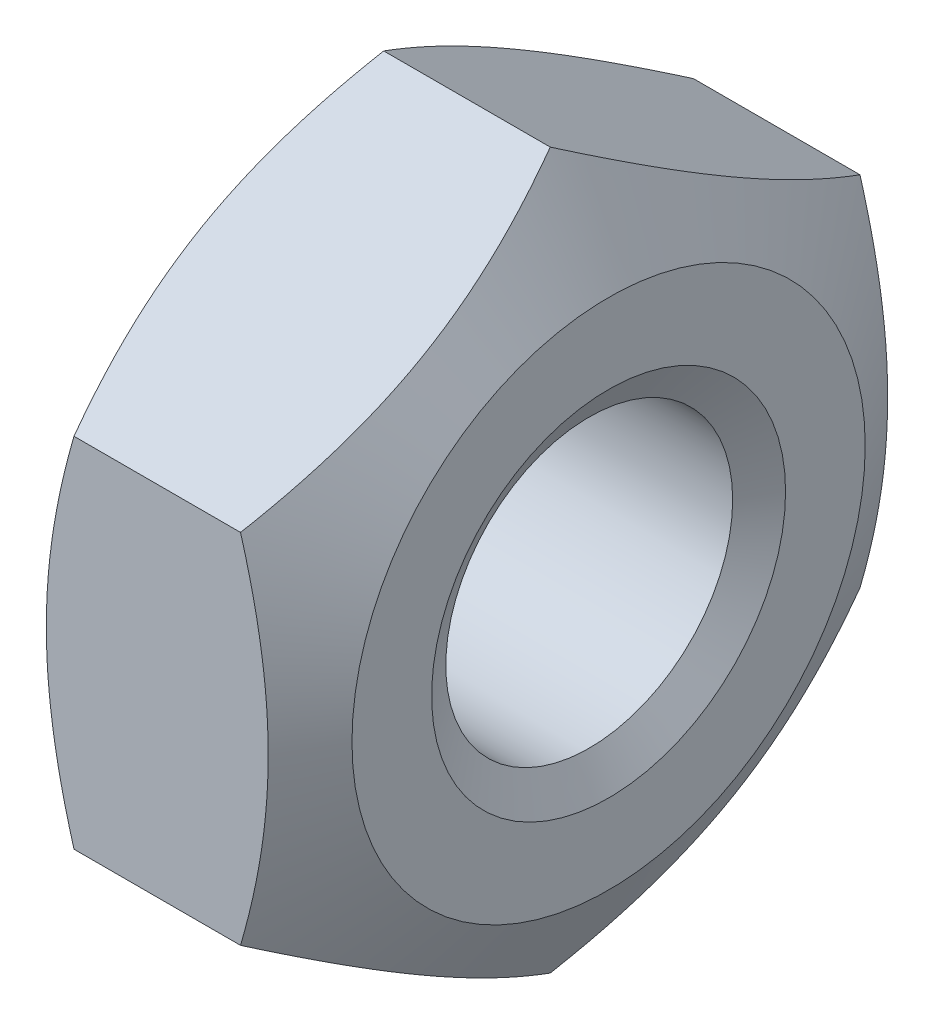
ISO-10303-21;
HEADER;
FILE_DESCRIPTION(('STEP AP214'),'2;1');
FILE_NAME('part.step','',(''),(''),'','','');
FILE_SCHEMA(('AUTOMOTIVE_DESIGN { 1 0 10303 214 1 1 1 1 }'));
ENDSEC;
DATA;
#1=APPLICATION_CONTEXT('core data for automotive mechanical design processes');
#2=APPLICATION_PROTOCOL_DEFINITION('international standard','automotive_design',2000,#1);
#3=PRODUCT_CONTEXT('',#1,'mechanical');
#4=PRODUCT('Part','Part','',(#3));
#5=PRODUCT_RELATED_PRODUCT_CATEGORY('part','',(#4));
#6=PRODUCT_DEFINITION_FORMATION('','',#4);
#7=PRODUCT_DEFINITION_CONTEXT('part definition',#1,'design');
#8=PRODUCT_DEFINITION('design','',#6,#7);
#9=PRODUCT_DEFINITION_SHAPE('','',#8);
#10=(LENGTH_UNIT() NAMED_UNIT(*) SI_UNIT(.MILLI.,.METRE.));
#11=(NAMED_UNIT(*) PLANE_ANGLE_UNIT() SI_UNIT($,.RADIAN.));
#12=(NAMED_UNIT(*) SI_UNIT($,.STERADIAN.) SOLID_ANGLE_UNIT());
#13=UNCERTAINTY_MEASURE_WITH_UNIT(LENGTH_MEASURE(1.E-05),#10,'distance_accuracy_value','');
#14=(GEOMETRIC_REPRESENTATION_CONTEXT(3) GLOBAL_UNCERTAINTY_ASSIGNED_CONTEXT((#13)) GLOBAL_UNIT_ASSIGNED_CONTEXT((#10,
#11,#12)) REPRESENTATION_CONTEXT('',''));
#15=CARTESIAN_POINT('',(0.,0.,0.));
#16=DIRECTION('',(0.,0.,1.));
#17=DIRECTION('',(1.,0.,0.));
#18=AXIS2_PLACEMENT_3D('',#15,#16,#17);
#19=CARTESIAN_POINT('',(0.,-2.02072594216368,-3.50000000000001));
#20=DIRECTION('',(0.,-0.866025403784438,-0.5));
#21=DIRECTION('',(0.,0.5,-0.866025403784438));
#22=AXIS2_PLACEMENT_3D('',#19,#20,#21);
#23=PLANE('',#22);
#24=CARTESIAN_POINT('',(2.54098243234402,-4.04145186335364,1.05730387721489E-08));
#25=CARTESIAN_POINT('',(2.59226523797011,-3.95265320966515,-0.153803799315165));
#26=CARTESIAN_POINT('',(2.63890426114671,-3.86308803875924,-0.308935238242743));
#27=CARTESIAN_POINT('',(2.72031127139525,-3.68240692851167,-0.621884110199617));
#28=CARTESIAN_POINT('',(2.75505046289533,-3.59128777984462,-0.779707101905921));
#29=CARTESIAN_POINT('',(2.80912451964991,-3.4101786785717,-1.09339726465732));
#30=CARTESIAN_POINT('',(2.82881931968208,-3.32021658406885,-1.24921618394851));
#31=CARTESIAN_POINT('',(2.85232640356528,-3.13986931398911,-1.5615868193555));
#32=CARTESIAN_POINT('',(2.85615815797964,-3.04948479347616,-1.7181374008686));
#33=CARTESIAN_POINT('',(2.84816643890119,-2.8806110130906,-2.0106353684167));
#34=CARTESIAN_POINT('',(2.83830519712314,-2.80209641231202,-2.14662664615081));
#35=CARTESIAN_POINT('',(2.8070571689875,-2.64557870777279,-2.41772326273343));
#36=CARTESIAN_POINT('',(2.78565971881456,-2.5675761449609,-2.55282766463117));
#37=CARTESIAN_POINT('',(2.73217023501321,-2.41073599912124,-2.82448276588128));
#38=CARTESIAN_POINT('',(2.69985156873856,-2.33191825631842,-2.96099910095637));
#39=CARTESIAN_POINT('',(2.62650185959993,-2.17545799733583,-3.23199621888499));
#40=CARTESIAN_POINT('',(2.58548803993308,-2.09781347826578,-3.36648047084625));
#41=CARTESIAN_POINT('',(2.54098243941357,-2.02072592848163,-3.50000002369801));
#42=B_SPLINE_CURVE_WITH_KNOTS('',3,(#24,#25,#26,#27,#28,#29,#30,#31,#32,#33,#34,#35,#36,#37,#38,
#39,#40,#41),.UNSPECIFIED.,.F.,.F.,(4,2,2,2,2,2,2,2,4),(0.,0.554778024541122,1.11088918798246,
1.65323832195628,2.19492156994785,2.66648863782462,3.13849236110487,3.62096286573508,
4.10248648456877),.UNSPECIFIED.);
#43=CARTESIAN_POINT('',(2.54098245410644,-4.04145187254427,2.04423438136269E-08));
#44=VERTEX_POINT('',#43);
#45=CARTESIAN_POINT('',(2.54098244250233,-2.02072593383152,-3.50000001443173));
#46=VERTEX_POINT('',#45);
#47=EDGE_CURVE('E166',#44,#46,#42,.T.);
#48=ORIENTED_EDGE('',*,*,#47,.F.);
#49=DIRECTION('',(1.,0.,0.));
#50=VECTOR('',#49,1.);
#51=CARTESIAN_POINT('',(0.,-4.04145188432738,0.));
#52=LINE('',#51,#50);
#53=CARTESIAN_POINT('',(0.659017545870468,-4.04145187253356,-2.04274992356394E-08));
#54=VERTEX_POINT('',#53);
#55=EDGE_CURVE('E85',#54,#44,#52,.T.);
#56=ORIENTED_EDGE('',*,*,#55,.F.);
#57=CARTESIAN_POINT('',(0.65901756229311,-2.02072592551266,-3.50000002884043));
#58=CARTESIAN_POINT('',(0.607734765482379,-2.10952459298091,-3.34619622514101));
#59=CARTESIAN_POINT('',(0.561095745603414,-2.19908976928281,-3.19106478919725));
#60=CARTESIAN_POINT('',(0.479688736896688,-2.37977088302352,-2.8781159202302));
#61=CARTESIAN_POINT('',(0.444949543639648,-2.47089002977117,-2.72029292852095));
#62=CARTESIAN_POINT('',(0.390875484413631,-2.6519991293776,-2.40660276628956));
#63=CARTESIAN_POINT('',(0.371180683659963,-2.74196122408516,-2.25078384750074));
#64=CARTESIAN_POINT('',(0.347673597873615,-2.92230849406983,-1.93841321288096));
#65=CARTESIAN_POINT('',(0.343841842272246,-3.01269301428337,-1.78186263165337));
#66=CARTESIAN_POINT('',(0.351833559119706,-3.18156679286572,-1.4893646670826));
#67=CARTESIAN_POINT('',(0.361694799623241,-3.26008139211948,-1.35337339203918));
#68=CARTESIAN_POINT('',(0.392942824841641,-3.41659909365437,-1.08227678069685));
#69=CARTESIAN_POINT('',(0.4143402733736,-3.49460165498667,-0.947172381348795));
#70=CARTESIAN_POINT('',(0.467829753610069,-3.65144179778075,-0.675517285363098));
#71=CARTESIAN_POINT('',(0.500148417940072,-3.73025953902051,-0.539000952998014));
#72=CARTESIAN_POINT('',(0.57349812305285,-3.88671979491684,-0.268003840420338));
#73=CARTESIAN_POINT('',(0.614511940637128,-3.96436431246378,-0.133519591099875));
#74=CARTESIAN_POINT('',(0.6590175390613,-4.04145186073973,-4.08549996774527E-08));
#75=B_SPLINE_CURVE_WITH_KNOTS('',3,(#57,#58,#59,#60,#61,#62,#63,#64,#65,#66,#67,#68,#69,#70,#71,
#72,#73,#74),.UNSPECIFIED.,.F.,.F.,(4,2,2,2,2,2,2,2,4),(0.,0.55477802242356,1.11088918424757,
1.65323831736308,2.19492156429469,2.66648862268166,3.13849233654852,3.62096283081612,
4.10248643921822),.UNSPECIFIED.);
#76=CARTESIAN_POINT('',(0.659017540174179,-2.02072589884351,-3.50000000000001));
#77=VERTEX_POINT('',#76);
#78=EDGE_CURVE('E167',#77,#54,#75,.T.);
#79=ORIENTED_EDGE('',*,*,#78,.F.);
#80=DIRECTION('',(1.,0.,0.));
#81=VECTOR('',#80,1.);
#82=CARTESIAN_POINT('',(0.,-2.02072594216368,-3.50000000000001));
#83=LINE('',#82,#81);
#84=EDGE_CURVE('E228',#46,#77,#83,.F.);
#85=ORIENTED_EDGE('',*,*,#84,.F.);
#86=EDGE_LOOP('',(#48,#56,#79,#85));
#87=FACE_BOUND('',#86,.T.);
#88=ADVANCED_FACE('F17',(#87),#23,.T.);
#89=CARTESIAN_POINT('',(0.,2.0207259421637,-3.5));
#90=DIRECTION('',(0.,0.,-1.));
#91=DIRECTION('',(0.,1.,0.));
#92=AXIS2_PLACEMENT_3D('',#89,#90,#91);
#93=PLANE('',#92);
#94=CARTESIAN_POINT('',(2.54098247231657,-2.02072585554845,-3.50000000000001));
#95=CARTESIAN_POINT('',(2.59226526629145,-1.84312852260944,-3.50000000000001));
#96=CARTESIAN_POINT('',(2.63890428315653,-1.66399817201581,-3.50000000000001));
#97=CARTESIAN_POINT('',(2.72031128560437,-1.30263594875082,-3.50000000000001));
#98=CARTESIAN_POINT('',(2.75505047562012,-1.12039765746304,-3.50000000000001));
#99=CARTESIAN_POINT('',(2.80912452842406,-0.758179462633444,-3.5));
#100=CARTESIAN_POINT('',(2.82881932598196,-0.578255275385868,-3.5));
#101=CARTESIAN_POINT('',(2.85232640559667,-0.217560740004404,-3.5));
#102=CARTESIAN_POINT('',(2.85615815821978,-0.0367917019971615,-3.5));
#103=CARTESIAN_POINT('',(2.84816643650571,0.300955841668033,-3.5));
#104=CARTESIAN_POINT('',(2.83830519473233,0.457985029143824,-3.5));
#105=CARTESIAN_POINT('',(2.80705716873138,0.771020410180367,-3.5));
#106=CARTESIAN_POINT('',(2.78565972069066,0.927025521843764,-3.5));
#107=CARTESIAN_POINT('',(2.73217024302477,1.24070578507881,-3.5));
#108=CARTESIAN_POINT('',(2.69985158083033,1.3983412562155,-3.5));
#109=CARTESIAN_POINT('',(2.62650188120573,1.71126174569054,-3.5));
#110=CARTESIAN_POINT('',(2.58548806696865,1.86655076980835,-3.5));
#111=CARTESIAN_POINT('',(2.54098247231567,2.02072585555157,-3.5));
#112=B_SPLINE_CURVE_WITH_KNOTS('',3,(#94,#95,#96,#97,#98,#99,#100,#101,#102,#103,#104,#105,#106,
#107,#108,#109,#110,#111),.UNSPECIFIED.,.F.,.F.,(4,2,2,2,2,2,2,2,4),(0.,0.554778014294481,
1.11088916777502,1.65323829338175,2.19492153288659,2.66648855859103,3.13849223965079,
3.62096269935576,4.10248627342897),.UNSPECIFIED.);
#113=CARTESIAN_POINT('',(2.54098245981429,2.02072589885763,-3.5));
#114=VERTEX_POINT('',#113);
#115=EDGE_CURVE('E142',#46,#114,#112,.T.);
#116=ORIENTED_EDGE('',*,*,#115,.F.);
#117=ORIENTED_EDGE('',*,*,#84,.T.);
#118=CARTESIAN_POINT('',(0.659017562298407,2.02072597548409,-3.5));
#119=CARTESIAN_POINT('',(0.607734765490899,1.84312864056012,-3.5));
#120=CARTESIAN_POINT('',(0.561095745614515,1.66399828796899,-3.5));
#121=CARTESIAN_POINT('',(0.479688736911374,1.30263606051491,-3.5));
#122=CARTESIAN_POINT('',(0.444949543655224,1.12039776703432,-3.5));
#123=CARTESIAN_POINT('',(0.390875484423931,0.758179567823057,-3.5));
#124=CARTESIAN_POINT('',(0.371180683666348,0.578255378394481,-3.5));
#125=CARTESIAN_POINT('',(0.347673597874942,0.217560838395818,-3.5));
#126=CARTESIAN_POINT('',(0.343841842272535,0.0367917979528558,-3.5));
#127=CARTESIAN_POINT('',(0.351833559039699,-0.300955755894309,-3.5));
#128=CARTESIAN_POINT('',(0.361694799202537,-0.457984951075556,-3.5));
#129=CARTESIAN_POINT('',(0.39294282327136,-0.77102034754808,-3.50000000000001));
#130=CARTESIAN_POINT('',(0.41434027099333,-0.927025466941833,-3.50000000000001));
#131=CARTESIAN_POINT('',(0.467829749210345,-1.24070574591259,-3.50000000000001));
#132=CARTESIAN_POINT('',(0.50014841231626,-1.39834122504882,-3.50000000000001));
#133=CARTESIAN_POINT('',(0.573498114714761,-1.71126173027654,-3.50000000000001));
#134=CARTESIAN_POINT('',(0.614511930810467,-1.86655076214833,-3.50000000000001));
#135=CARTESIAN_POINT('',(0.659017527668722,-2.02072585552333,-3.50000000000001));
#136=B_SPLINE_CURVE_WITH_KNOTS('',3,(#118,#119,#120,#121,#122,#123,#124,#125,#126,#127,#128,
#129,#130,#131,#132,#133,#134,#135),.UNSPECIFIED.,.F.,.F.,(4,2,2,2,2,2,2,2,4),(0.,
0.554778022384868,1.11088918416509,1.65323831732238,2.19492156429948,2.6664886126934,
3.13849231653025,3.62096280024698,4.10248639817856),.UNSPECIFIED.);
#137=CARTESIAN_POINT('',(0.659017540179338,2.02072596381484,-3.49999996249911));
#138=VERTEX_POINT('',#137);
#139=EDGE_CURVE('E98',#138,#77,#136,.T.);
#140=ORIENTED_EDGE('',*,*,#139,.F.);
#141=DIRECTION('',(1.,0.,0.));
#142=VECTOR('',#141,1.);
#143=CARTESIAN_POINT('',(0.,2.02072594216369,-3.5));
#144=LINE('',#143,#142);
#145=EDGE_CURVE('E230',#114,#138,#144,.F.);
#146=ORIENTED_EDGE('',*,*,#145,.F.);
#147=EDGE_LOOP('',(#116,#117,#140,#146));
#148=FACE_BOUND('',#147,.T.);
#149=ADVANCED_FACE('F178',(#148),#93,.T.);
#150=CARTESIAN_POINT('',(0.,4.04145188432738,0.));
#151=DIRECTION('',(0.,0.866025403784439,-0.499999999999999));
#152=DIRECTION('',(0.,0.499999999999999,0.866025403784439));
#153=AXIS2_PLACEMENT_3D('',#150,#151,#152);
#154=PLANE('',#153);
#155=CARTESIAN_POINT('',(2.54098241502982,2.02072589629589,-3.50000000444495));
#156=CARTESIAN_POINT('',(2.59226522707685,2.10952458373136,-3.34619621422492));
#157=CARTESIAN_POINT('',(2.6389042534438,2.19908976886081,-3.19106478270868));
#158=CARTESIAN_POINT('',(2.72031126714633,2.37977089033219,-2.8781159148081));
#159=CARTESIAN_POINT('',(2.75505045890835,2.47089003595753,-2.72029291972169));
#160=CARTESIAN_POINT('',(2.80912451681805,2.65199913583967,-2.40660275322853));
#161=CARTESIAN_POINT('',(2.8288193177353,2.74196123187729,-2.25078383350633));
#162=CARTESIAN_POINT('',(2.85232640301125,2.92230850387419,-1.93841319639675));
#163=CARTESIAN_POINT('',(2.85615815793057,3.01269302477108,-1.78186261361288));
#164=CARTESIAN_POINT('',(2.84816643985052,3.18156680143987,-1.48936465212316));
#165=CARTESIAN_POINT('',(2.83830519933318,3.2600813980844,-1.35337338167837));
#166=CARTESIAN_POINT('',(2.80705717485548,3.41659909435791,-1.08227677950759));
#167=CARTESIAN_POINT('',(2.78565972708412,3.49460165303832,-0.947172384731895));
#168=CARTESIAN_POINT('',(2.73217024903826,3.65144179059194,-0.675517297805853));
#169=CARTESIAN_POINT('',(2.69985158614694,3.73025952924427,-0.539000969926646));
#170=CARTESIAN_POINT('',(2.62650188437565,3.88671978009631,-0.268003866094569));
#171=CARTESIAN_POINT('',(2.58548806868707,3.96436429518551,-0.133519621035308));
#172=CARTESIAN_POINT('',(2.54098247230798,4.04145184103465,-7.49852126264409E-08));
#173=B_SPLINE_CURVE_WITH_KNOTS('',3,(#155,#156,#157,#158,#159,#160,#161,#162,#163,#164,#165,
#166,#167,#168,#169,#170,#171,#172),.UNSPECIFIED.,.F.,.F.,(4,2,2,2,2,2,2,2,4),(0.,
0.554778028945484,1.11088919655613,1.65323833428363,2.19492158613276,2.66648862876641,
3.13849232664483,3.62096280485109,4.10248639756262),.UNSPECIFIED.);
#174=CARTESIAN_POINT('',(2.54098245981044,4.04145186268101,-3.74926060380803E-08));
#175=VERTEX_POINT('',#174);
#176=EDGE_CURVE('E125',#114,#175,#173,.T.);
#177=ORIENTED_EDGE('',*,*,#176,.F.);
#178=ORIENTED_EDGE('',*,*,#145,.T.);
#179=CARTESIAN_POINT('',(0.65901756229483,4.04145190098139,2.88455858767613E-08));
#180=CARTESIAN_POINT('',(0.60773476548761,3.95265323351949,-0.153803774842825));
#181=CARTESIAN_POINT('',(0.561095745611535,3.86308805722403,-0.308935210775432));
#182=CARTESIAN_POINT('',(0.479688736909035,3.68240694349719,-0.621884079718445));
#183=CARTESIAN_POINT('',(0.444949543653219,3.591287796757,-0.779707071414777));
#184=CARTESIAN_POINT('',(0.390875484422594,3.4101786971516,-1.09339723364439));
#185=CARTESIAN_POINT('',(0.371180683665345,3.32021660243743,-1.24921615244466));
#186=CARTESIAN_POINT('',(0.34767359787458,3.13986933243835,-1.56158678708941));
#187=CARTESIAN_POINT('',(0.343841842272481,3.049484812217,-1.71813736833052));
#188=CARTESIAN_POINT('',(0.35183355904023,2.88061103529241,-2.01063533002996));
#189=CARTESIAN_POINT('',(0.361694799203548,2.80209643770065,-2.14662660219471));
#190=CARTESIAN_POINT('',(0.392942823273631,2.64557873946214,-2.41772320782754));
#191=CARTESIAN_POINT('',(0.414340270996381,2.56757617976416,-2.55282760434488));
#192=CARTESIAN_POINT('',(0.467829749215202,2.41073604027654,-2.82448269460363));
#193=CARTESIAN_POINT('',(0.500148412322153,2.3319183007073,-2.96099902407529));
#194=CARTESIAN_POINT('',(0.573498114722872,2.17545804809122,-3.2319961309714));
#195=CARTESIAN_POINT('',(0.61451193081976,2.09781353215424,-3.36648037750333));
#196=CARTESIAN_POINT('',(0.659017527679231,2.02072598546567,-3.49999992499878));
#197=B_SPLINE_CURVE_WITH_KNOTS('',3,(#179,#180,#181,#182,#183,#184,#185,#186,#187,#188,#189,
#190,#191,#192,#193,#194,#195,#196),.UNSPECIFIED.,.F.,.F.,(4,2,2,2,2,2,2,2,4),(0.,
0.554778022384068,1.11088918416347,1.65323831731994,2.19492156429623,2.66648861269703,
3.13849231654078,3.62096280026478,4.10248639820355),.UNSPECIFIED.);
#198=CARTESIAN_POINT('',(0.659017540181126,4.04145186267933,3.74955294079554E-08));
#199=VERTEX_POINT('',#198);
#200=EDGE_CURVE('E97',#199,#138,#197,.T.);
#201=ORIENTED_EDGE('',*,*,#200,.F.);
#202=DIRECTION('',(1.,0.,0.));
#203=VECTOR('',#202,1.);
#204=CARTESIAN_POINT('',(0.,4.04145188432738,0.));
#205=LINE('',#204,#203);
#206=EDGE_CURVE('E86',#175,#199,#205,.F.);
#207=ORIENTED_EDGE('',*,*,#206,.F.);
#208=EDGE_LOOP('',(#177,#178,#201,#207));
#209=FACE_BOUND('',#208,.T.);
#210=ADVANCED_FACE('F114',(#209),#154,.T.);
#211=CARTESIAN_POINT('',(0.,2.02072594216369,3.5));
#212=DIRECTION('',(0.,0.866025403784438,0.5));
#213=DIRECTION('',(0.,-0.5,0.866025403784438));
#214=AXIS2_PLACEMENT_3D('',#211,#212,#213);
#215=PLANE('',#214);
#216=CARTESIAN_POINT('',(2.54098241504255,4.04145186523754,-4.19191616143354E-08));
#217=CARTESIAN_POINT('',(2.59226522708557,3.9526532194218,0.153803772329944));
#218=CARTESIAN_POINT('',(2.6389042534504,3.86308805136641,0.308935213703224));
#219=CARTESIAN_POINT('',(2.72031126715042,3.68240694241403,0.621884088829795));
#220=CARTESIAN_POINT('',(2.75505045891205,3.59128779218156,0.779707081255083));
#221=CARTESIAN_POINT('',(2.80912451682062,3.41017868902345,1.09339724585476));
#222=CARTESIAN_POINT('',(2.82881931773713,3.32021659417286,1.24921616626136));
#223=CARTESIAN_POINT('',(2.85232640301182,3.13986932303885,1.56158680386716));
#224=CARTESIAN_POINT('',(2.85615815793063,3.04948480181968,1.71813738646393));
#225=CARTESIAN_POINT('',(2.84816643984984,2.88061102495105,2.01063534783315));
#226=CARTESIAN_POINT('',(2.83830519933244,2.80209642837697,2.14662661831454));
#227=CARTESIAN_POINT('',(2.80705717485518,2.64557873215768,2.41772322050853));
#228=CARTESIAN_POINT('',(2.7856597270843,2.56757617346096,2.55282761527079));
#229=CARTESIAN_POINT('',(2.7321702490399,2.4107360358961,2.82448270218213));
#230=CARTESIAN_POINT('',(2.69985158614955,2.33191829724932,2.96099903006036));
#231=CARTESIAN_POINT('',(2.62650188438058,2.17545804640833,3.23199613389055));
#232=CARTESIAN_POINT('',(2.58548806869332,2.0978135313246,3.36648037894891));
#233=CARTESIAN_POINT('',(2.54098247231568,2.02072598546976,3.49999992499169));
#234=B_SPLINE_CURVE_WITH_KNOTS('',3,(#216,#217,#218,#219,#220,#221,#222,#223,#224,#225,#226,
#227,#228,#229,#230,#231,#232,#233),.UNSPECIFIED.,.F.,.F.,(4,2,2,2,2,2,2,2,4),(0.,
0.554778028942201,1.11088919654968,1.65323833427451,2.19492158612092,2.66648862874406,
3.13849232661197,3.62096280480698,4.10248639750729),.UNSPECIFIED.);
#235=CARTESIAN_POINT('',(2.54098245981429,2.02072596381672,3.49999996249585));
#236=VERTEX_POINT('',#235);
#237=EDGE_CURVE('E119',#175,#236,#234,.T.);
#238=ORIENTED_EDGE('',*,*,#237,.F.);
#239=ORIENTED_EDGE('',*,*,#206,.T.);
#240=CARTESIAN_POINT('',(0.659017562298406,2.02072592550349,3.50000002885631));
#241=CARTESIAN_POINT('',(0.607734765490893,2.10952459296549,3.34619622516772));
#242=CARTESIAN_POINT('',(0.561095745614505,2.19908976926106,3.19106478923493));
#243=CARTESIAN_POINT('',(0.479688736911358,2.37977088298811,2.87811592029154));
#244=CARTESIAN_POINT('',(0.444949543655207,2.47089002972842,2.72029292859501));
#245=CARTESIAN_POINT('',(0.390875484423919,2.65199912933405,2.406602766365));
#246=CARTESIAN_POINT('',(0.371180683666341,2.74196122404833,2.25078384756454));
#247=CARTESIAN_POINT('',(0.347673597874939,2.92230849404765,1.93841321291939));
#248=CARTESIAN_POINT('',(0.343841842272533,3.01269301426912,1.78186263167806));
#249=CARTESIAN_POINT('',(0.351833559039794,3.18156679119472,1.48936466997686));
#250=CARTESIAN_POINT('',(0.361694799203047,3.26008138878738,1.35337339781056));
#251=CARTESIAN_POINT('',(0.392942823273272,3.41659908702767,1.08227679217465));
#252=CARTESIAN_POINT('',(0.414340270996229,3.49460164672654,0.947172395655775));
#253=CARTESIAN_POINT('',(0.467829749215708,3.65144178621595,0.675517305393916));
#254=CARTESIAN_POINT('',(0.500148412323117,3.73025952578611,0.539000975920678));
#255=CARTESIAN_POINT('',(0.573498114724929,3.88671977840397,0.268003869021471));
#256=CARTESIAN_POINT('',(0.614511930822452,3.96436429434183,0.13351962248801));
#257=CARTESIAN_POINT('',(0.659017527682617,4.04145184103127,7.49910581406929E-08));
#258=B_SPLINE_CURVE_WITH_KNOTS('',3,(#240,#241,#242,#243,#244,#245,#246,#247,#248,#249,#250,
#251,#252,#253,#254,#255,#256,#257),.UNSPECIFIED.,.F.,.F.,(4,2,2,2,2,2,2,2,4),(0.,
0.554778022384917,1.11088918416519,1.65323831732243,2.19492156429948,2.66648861270559,
3.13849231655468,3.62096280028429,4.10248639822865),.UNSPECIFIED.);
#259=CARTESIAN_POINT('',(0.659017540179337,2.02072589886139,3.5));
#260=VERTEX_POINT('',#259);
#261=EDGE_CURVE('E92',#260,#199,#258,.T.);
#262=ORIENTED_EDGE('',*,*,#261,.F.);
#263=DIRECTION('',(1.,0.,0.));
#264=VECTOR('',#263,1.);
#265=CARTESIAN_POINT('',(0.,2.02072594216369,3.5));
#266=LINE('',#265,#264);
#267=EDGE_CURVE('E79',#236,#260,#266,.F.);
#268=ORIENTED_EDGE('',*,*,#267,.F.);
#269=EDGE_LOOP('',(#238,#239,#262,#268));
#270=FACE_BOUND('',#269,.T.);
#271=ADVANCED_FACE('F95',(#270),#215,.T.);
#272=CARTESIAN_POINT('',(0.,-2.02072594216369,3.5));
#273=DIRECTION('',(0.,0.,1.));
#274=DIRECTION('',(1.,0.,0.));
#275=AXIS2_PLACEMENT_3D('',#272,#273,#274);
#276=PLANE('',#275);
#277=CARTESIAN_POINT('',(2.54098241502981,2.02072596894704,3.49999996249979));
#278=CARTESIAN_POINT('',(2.59226522707685,1.84312863570043,3.49999998653161));
#279=CARTESIAN_POINT('',(2.6389042534438,1.66399828251719,3.49999999639024));
#280=CARTESIAN_POINT('',(2.72031126714633,1.30263605209402,3.50000000361843));
#281=CARTESIAN_POINT('',(2.75505045890835,1.12039775623519,3.50000000095791));
#282=CARTESIAN_POINT('',(2.80912451681805,0.758179553193667,3.49999999906579));
#283=CARTESIAN_POINT('',(2.8288193177353,0.578255362305184,3.49999999975097));
#284=CARTESIAN_POINT('',(2.85232640301125,0.217560819173498,3.50000000024872));
#285=CARTESIAN_POINT('',(2.85615815793057,0.0367917770569541,3.50000000006237));
#286=CARTESIAN_POINT('',(2.84816643985054,-0.300955776481898,3.4999999999457));
#287=CARTESIAN_POINT('',(2.83830519933328,-0.457984969701466,3.49999999998536));
#288=CARTESIAN_POINT('',(2.80705717485586,-0.771020362196161,3.50000000001465));
#289=CARTESIAN_POINT('',(2.78565972708469,-0.927025479574252,3.50000000000422));
#290=CARTESIAN_POINT('',(2.73217024903933,-1.24070575469468,3.49999999999568));
#291=CARTESIAN_POINT('',(2.69985158614829,-1.3983412319948,3.49999999999784));
#292=CARTESIAN_POINT('',(2.62650188437767,-1.71126173368982,3.50000000000215));
#293=CARTESIAN_POINT('',(2.58548806868944,-1.86655076386374,3.5000000000043));
#294=CARTESIAN_POINT('',(2.54098247231073,-2.02072585556869,3.5));
#295=B_SPLINE_CURVE_WITH_KNOTS('',3,(#277,#278,#279,#280,#281,#282,#283,#284,#285,#286,#287,
#288,#289,#290,#291,#292,#293,#294),.UNSPECIFIED.,.F.,.F.,(4,2,2,2,2,2,2,2,4),(0.,
0.554778028945476,1.11088919655611,1.65323833428362,2.19492158613276,2.666488628764,
3.13849232664,3.62096280484371,4.1024863975527),.UNSPECIFIED.);
#296=CARTESIAN_POINT('',(2.54098245981182,-2.02072589886619,3.5));
#297=VERTEX_POINT('',#296);
#298=EDGE_CURVE('E41',#236,#297,#295,.T.);
#299=ORIENTED_EDGE('',*,*,#298,.F.);
#300=ORIENTED_EDGE('',*,*,#267,.T.);
#301=CARTESIAN_POINT('',(0.659017527672026,-2.02072585555089,3.5000000000071));
#302=CARTESIAN_POINT('',(0.607734733699998,-1.84312852261154,3.50000000000255));
#303=CARTESIAN_POINT('',(0.561095716836118,-1.66399817201801,3.50000000000068));
#304=CARTESIAN_POINT('',(0.479688714389161,-1.30263594875353,3.49999999999931));
#305=CARTESIAN_POINT('',(0.444949524373093,-1.12039765746617,3.49999999999982));
#306=CARTESIAN_POINT('',(0.390875471568845,-0.758179462637257,3.50000000000018));
#307=CARTESIAN_POINT('',(0.371180674010941,-0.578255275389938,3.50000000000005));
#308=CARTESIAN_POINT('',(0.34767359439607,-0.217560740009028,3.49999999999995));
#309=CARTESIAN_POINT('',(0.343841841772801,-0.0367917020020811,3.49999999999999));
#310=CARTESIAN_POINT('',(0.351833563486597,0.300955841663963,3.50000000000001));
#311=CARTESIAN_POINT('',(0.361694805259964,0.457985029140894,3.5));
#312=CARTESIAN_POINT('',(0.392942831261049,0.771020410179716,3.5));
#313=CARTESIAN_POINT('',(0.414340279301933,0.927025521844251,3.5));
#314=CARTESIAN_POINT('',(0.467829756968274,1.24070578508156,3.5));
#315=CARTESIAN_POINT('',(0.500148419163024,1.39834125621937,3.5));
#316=CARTESIAN_POINT('',(0.573498118788329,1.7112617456966,3.5));
#317=CARTESIAN_POINT('',(0.614511933025821,1.86655076981548,3.5));
#318=CARTESIAN_POINT('',(0.65901752767923,2.02072585555975,3.5));
#319=B_SPLINE_CURVE_WITH_KNOTS('',3,(#301,#302,#303,#304,#305,#306,#307,#308,#309,#310,#311,
#312,#313,#314,#315,#316,#317,#318),.UNSPECIFIED.,.F.,.F.,(4,2,2,2,2,2,2,2,4),(0.,
0.554778014293328,1.11088916777286,1.65323829337879,2.19492153288277,2.6664885585906,
3.1384922396538,3.62096269936225,4.10248627343886),.UNSPECIFIED.);
#320=CARTESIAN_POINT('',(0.659017557490383,-2.02072593383123,3.50000001443224));
#321=VERTEX_POINT('',#320);
#322=EDGE_CURVE('E21',#321,#260,#319,.T.);
#323=ORIENTED_EDGE('',*,*,#322,.F.);
#324=DIRECTION('',(1.,0.,0.));
#325=VECTOR('',#324,1.);
#326=CARTESIAN_POINT('',(0.,-2.02072594216369,3.5));
#327=LINE('',#326,#325);
#328=EDGE_CURVE('E73',#297,#321,#327,.F.);
#329=ORIENTED_EDGE('',*,*,#328,.F.);
#330=EDGE_LOOP('',(#299,#300,#323,#329));
#331=FACE_BOUND('',#330,.T.);
#332=ADVANCED_FACE('F81',(#331),#276,.T.);
#333=CARTESIAN_POINT('',(0.,-4.04145188432738,0.));
#334=DIRECTION('',(0.,-0.866025403784439,0.5));
#335=DIRECTION('',(0.,-0.5,-0.866025403784439));
#336=AXIS2_PLACEMENT_3D('',#333,#334,#335);
#337=PLANE('',#336);
#338=CARTESIAN_POINT('',(2.54098241503799,-2.02072589630862,3.50000000443361));
#339=CARTESIAN_POINT('',(2.59226522708598,-2.10952458374729,3.34619621420117));
#340=CARTESIAN_POINT('',(2.63890425345451,-2.1990897688816,3.19106478267368));
#341=CARTESIAN_POINT('',(2.72031126715982,-2.37977089036511,2.87811591475004));
#342=CARTESIAN_POINT('',(2.75505045892293,-2.47089003599772,2.72029291965181));
#343=CARTESIAN_POINT('',(2.80912451682776,-2.6519991358806,2.4066027531579));
#344=CARTESIAN_POINT('',(2.82881931774122,-2.74196123191154,2.25078383344708));
#345=CARTESIAN_POINT('',(2.85232640301238,-2.922308503894,1.93841319636238));
#346=CARTESIAN_POINT('',(2.85615815793081,-3.01269302478312,1.781862613592));
#347=CARTESIAN_POINT('',(2.8481664397734,-3.18156680305469,1.4893646493262));
#348=CARTESIAN_POINT('',(2.83830519892693,-3.26008140130633,1.35337337609783));
#349=CARTESIAN_POINT('',(2.80705717333855,-3.41659910076733,1.08227676840614));
#350=CARTESIAN_POINT('',(2.78565972478458,-3.49460166102807,0.947172370893232));
#351=CARTESIAN_POINT('',(2.73217024478748,-3.65144180177891,0.675517278429444));
#352=CARTESIAN_POINT('',(2.69985158071338,-3.73025954204657,0.539000947752422));
#353=CARTESIAN_POINT('',(2.62650187631943,-3.88671979607046,0.268003838426527));
#354=CARTESIAN_POINT('',(2.5854880591925,-3.96436431271642,0.133519590670895));
#355=CARTESIAN_POINT('',(2.54098246130032,-4.04145186010047,4.19622383812782E-08));
#356=B_SPLINE_CURVE_WITH_KNOTS('',3,(#338,#339,#340,#341,#342,#343,#344,#345,#346,#347,#348,
#349,#350,#351,#352,#353,#354,#355),.UNSPECIFIED.,.F.,.F.,(4,2,2,2,2,2,2,2,4),(0.,
0.554778028981973,1.11088919663414,1.65323833432066,2.19492158612518,2.66648863841517,
3.13849234598569,3.62096283438724,4.10248643721638),.UNSPECIFIED.);
#357=EDGE_CURVE('E149',#297,#44,#356,.T.);
#358=ORIENTED_EDGE('',*,*,#357,.F.);
#359=ORIENTED_EDGE('',*,*,#328,.T.);
#360=CARTESIAN_POINT('',(0.659017553481739,-4.04145188571667,-2.40631252558762E-09));
#361=CARTESIAN_POINT('',(0.60773475738445,-3.95265321848792,0.15380380087827));
#362=CARTESIAN_POINT('',(0.561095738265657,-3.86308804242696,0.308935236404704));
#363=CARTESIAN_POINT('',(0.479688731141636,-3.68240692919075,0.621884104497933));
#364=CARTESIAN_POINT('',(0.444949538706445,-3.5912877827068,0.77970709575045));
#365=CARTESIAN_POINT('',(0.390875481124943,-3.41017868365562,1.09339725702011));
#366=CARTESIAN_POINT('',(0.371180681192576,-3.32021658923898,1.24921617530505));
#367=CARTESIAN_POINT('',(0.347673596986583,-3.13986931987104,1.56158680885662));
#368=CARTESIAN_POINT('',(0.34384184214463,-3.04948479998326,1.71813738951998));
#369=CARTESIAN_POINT('',(0.351833560413313,-2.88061101931153,2.01063535770966));
#370=CARTESIAN_POINT('',(0.361694802021156,-2.80209641764474,2.14662663693257));
#371=CARTESIAN_POINT('',(0.392942830075499,-2.64557871134337,2.4177232565307));
#372=CARTESIAN_POINT('',(0.414340280340639,-2.56757614765772,2.55282765995485));
#373=CARTESIAN_POINT('',(0.467829764556154,-2.41073600011472,2.82448276416594));
#374=CARTESIAN_POINT('',(0.500148431151276,-2.33191825648194,2.96099910067585));
#375=CARTESIAN_POINT('',(0.573498141095349,-2.17545799589233,3.23199622138252));
#376=CARTESIAN_POINT('',(0.614511961243469,-2.09781347604479,3.36648047468776));
#377=CARTESIAN_POINT('',(0.659017562301131,-2.02072592549877,3.50000002886449));
#378=B_SPLINE_CURVE_WITH_KNOTS('',3,(#360,#361,#362,#363,#364,#365,#366,#367,#368,#369,#370,
#371,#372,#373,#374,#375,#376,#377),.UNSPECIFIED.,.F.,.F.,(4,2,2,2,2,2,2,2,4),(0.,
0.55477802044601,1.11088918024966,1.65323831136071,2.19492155630019,2.66648862930287,
3.13849235783858,3.62096286752357,4.10248649121818),.UNSPECIFIED.);
#379=EDGE_CURVE('E94',#54,#321,#378,.T.);
#380=ORIENTED_EDGE('',*,*,#379,.F.);
#381=ORIENTED_EDGE('',*,*,#55,.T.);
#382=EDGE_LOOP('',(#358,#359,#380,#381));
#383=FACE_BOUND('',#382,.T.);
#384=ADVANCED_FACE('F157',(#383),#337,.T.);
#385=CARTESIAN_POINT('',(0.662971657959588,0.,0.));
#386=DIRECTION('',(1.,0.,0.));
#387=DIRECTION('',(0.,0.,-1.));
#388=AXIS2_PLACEMENT_3D('',#385,#386,#387);
#389=CONICAL_SURFACE('',#388,4.04830059557071,1.04719755119491);
#390=CARTESIAN_POINT('',(0.,0.,0.));
#391=DIRECTION('',(1.,0.,0.));
#392=DIRECTION('',(0.,0.,-1.));
#393=AXIS2_PLACEMENT_3D('',#390,#391,#392);
#394=CIRCLE('',#393,2.900000000011);
#395=CARTESIAN_POINT('',(0.,0.,-2.900000000011));
#396=VERTEX_POINT('',#395);
#397=EDGE_CURVE('E155',#396,#396,#394,.T.);
#398=ORIENTED_EDGE('',*,*,#397,.T.);
#399=EDGE_LOOP('',(#398));
#400=FACE_BOUND('',#399,.T.);
#401=ORIENTED_EDGE('',*,*,#78,.T.);
#402=ORIENTED_EDGE('',*,*,#379,.T.);
#403=ORIENTED_EDGE('',*,*,#322,.T.);
#404=ORIENTED_EDGE('',*,*,#261,.T.);
#405=ORIENTED_EDGE('',*,*,#200,.T.);
#406=ORIENTED_EDGE('',*,*,#139,.T.);
#407=EDGE_LOOP('',(#401,#402,#403,#404,#405,#406));
#408=FACE_BOUND('',#407,.T.);
#409=ADVANCED_FACE('F90',(#400,#408),#389,.T.);
#410=CARTESIAN_POINT('',(2.53702834203295,0.,0.));
#411=DIRECTION('',(-1.,0.,0.));
#412=DIRECTION('',(0.,0.,1.));
#413=AXIS2_PLACEMENT_3D('',#410,#411,#412);
#414=CONICAL_SURFACE('',#413,4.04830059557071,1.04719755119491);
#415=ORIENTED_EDGE('',*,*,#357,.T.);
#416=ORIENTED_EDGE('',*,*,#47,.T.);
#417=ORIENTED_EDGE('',*,*,#115,.T.);
#418=ORIENTED_EDGE('',*,*,#176,.T.);
#419=ORIENTED_EDGE('',*,*,#237,.T.);
#420=ORIENTED_EDGE('',*,*,#298,.T.);
#421=EDGE_LOOP('',(#415,#416,#417,#418,#419,#420));
#422=FACE_BOUND('',#421,.T.);
#423=CARTESIAN_POINT('',(3.19999999999254,0.,0.));
#424=DIRECTION('',(-1.,0.,0.));
#425=DIRECTION('',(0.,0.,1.));
#426=AXIS2_PLACEMENT_3D('',#423,#424,#425);
#427=CIRCLE('',#426,2.900000000011);
#428=CARTESIAN_POINT('',(3.19999999999254,0.,2.900000000011));
#429=VERTEX_POINT('',#428);
#430=EDGE_CURVE('E220',#429,#429,#427,.F.);
#431=ORIENTED_EDGE('',*,*,#430,.F.);
#432=EDGE_LOOP('',(#431));
#433=FACE_BOUND('',#432,.T.);
#434=ADVANCED_FACE('F134',(#422,#433),#414,.T.);
#435=CARTESIAN_POINT('',(0.,0.,0.));
#436=DIRECTION('',(1.,0.,0.));
#437=DIRECTION('',(0.,0.,-1.));
#438=AXIS2_PLACEMENT_3D('',#435,#436,#437);
#439=PLANE('',#438);
#440=CARTESIAN_POINT('',(1.52311481822252E-11,0.,0.));
#441=DIRECTION('',(-1.,0.,0.));
#442=DIRECTION('',(0.,0.,1.));
#443=AXIS2_PLACEMENT_3D('',#440,#441,#442);
#444=CIRCLE('',#443,1.99988611410618);
#445=CARTESIAN_POINT('',(1.52311481822252E-11,0.,1.99988611410618));
#446=VERTEX_POINT('',#445);
#447=EDGE_CURVE('E222',#446,#446,#444,.F.);
#448=ORIENTED_EDGE('',*,*,#447,.T.);
#449=EDGE_LOOP('',(#448));
#450=FACE_BOUND('',#449,.T.);
#451=ORIENTED_EDGE('',*,*,#397,.F.);
#452=EDGE_LOOP('',(#451));
#453=FACE_BOUND('',#452,.T.);
#454=ADVANCED_FACE('F138',(#450,#453),#439,.F.);
#455=CARTESIAN_POINT('',(3.2,0.,0.));
#456=DIRECTION('',(1.,0.,0.));
#457=DIRECTION('',(0.,0.,-1.));
#458=AXIS2_PLACEMENT_3D('',#455,#456,#457);
#459=PLANE('',#458);
#460=CARTESIAN_POINT('',(3.20000000004059,0.,0.));
#461=DIRECTION('',(1.,0.,0.));
#462=DIRECTION('',(0.,0.,-1.));
#463=AXIS2_PLACEMENT_3D('',#460,#461,#462);
#464=CIRCLE('',#463,1.99988611416302);
#465=CARTESIAN_POINT('',(3.20000000004059,0.,-1.99988611416302));
#466=VERTEX_POINT('',#465);
#467=EDGE_CURVE('E217',#466,#466,#464,.F.);
#468=ORIENTED_EDGE('',*,*,#467,.T.);
#469=EDGE_LOOP('',(#468));
#470=FACE_BOUND('',#469,.T.);
#471=ORIENTED_EDGE('',*,*,#430,.T.);
#472=EDGE_LOOP('',(#471));
#473=FACE_BOUND('',#472,.T.);
#474=ADVANCED_FACE('F206',(#470,#473),#459,.T.);
#475=CARTESIAN_POINT('',(1.13686837721616E-10,0.,0.));
#476=DIRECTION('',(-1.,0.,0.));
#477=DIRECTION('',(0.,0.,1.));
#478=AXIS2_PLACEMENT_3D('',#475,#476,#477);
#479=CONICAL_SURFACE('',#478,1.99988611393564,1.04719755121176);
#480=CARTESIAN_POINT('',(0.21875,0.,0.));
#481=DIRECTION('',(1.,0.,0.));
#482=DIRECTION('',(0.,0.,-1.));
#483=AXIS2_PLACEMENT_3D('',#480,#481,#482);
#484=CIRCLE('',#483,1.621);
#485=CARTESIAN_POINT('',(0.21875,0.,-1.621));
#486=VERTEX_POINT('',#485);
#487=EDGE_CURVE('E32',#486,#486,#484,.T.);
#488=ORIENTED_EDGE('',*,*,#487,.T.);
#489=EDGE_LOOP('',(#488));
#490=FACE_BOUND('',#489,.T.);
#491=ORIENTED_EDGE('',*,*,#447,.F.);
#492=EDGE_LOOP('',(#491));
#493=FACE_BOUND('',#492,.T.);
#494=ADVANCED_FACE('F199',(#490,#493),#479,.F.);
#495=CARTESIAN_POINT('',(3.20000000010623,0.,0.));
#496=DIRECTION('',(1.,0.,0.));
#497=DIRECTION('',(0.,0.,-1.));
#498=AXIS2_PLACEMENT_3D('',#495,#496,#497);
#499=CONICAL_SURFACE('',#498,1.99988611427671,1.04719755124657);
#500=CARTESIAN_POINT('',(2.98125,0.,0.));
#501=DIRECTION('',(1.,0.,0.));
#502=DIRECTION('',(0.,0.,-1.));
#503=AXIS2_PLACEMENT_3D('',#500,#501,#502);
#504=CIRCLE('',#503,1.621);
#505=CARTESIAN_POINT('',(2.98125,0.,-1.621));
#506=VERTEX_POINT('',#505);
#507=EDGE_CURVE('E11',#506,#506,#504,.F.);
#508=ORIENTED_EDGE('',*,*,#507,.T.);
#509=EDGE_LOOP('',(#508));
#510=FACE_BOUND('',#509,.T.);
#511=ORIENTED_EDGE('',*,*,#467,.F.);
#512=EDGE_LOOP('',(#511));
#513=FACE_BOUND('',#512,.T.);
#514=ADVANCED_FACE('F193',(#510,#513),#499,.F.);
#515=CARTESIAN_POINT('',(-7.96124246369254,0.,0.));
#516=DIRECTION('',(1.,0.,0.));
#517=DIRECTION('',(0.,0.,-1.));
#518=AXIS2_PLACEMENT_3D('',#515,#516,#517);
#519=CYLINDRICAL_SURFACE('',#518,1.621);
#520=ORIENTED_EDGE('',*,*,#487,.F.);
#521=EDGE_LOOP('',(#520));
#522=FACE_BOUND('',#521,.T.);
#523=ORIENTED_EDGE('',*,*,#507,.F.);
#524=EDGE_LOOP('',(#523));
#525=FACE_BOUND('',#524,.T.);
#526=ADVANCED_FACE('F191',(#522,#525),#519,.F.);
#527=CLOSED_SHELL('',(#88,#149,#210,#271,#332,#384,#409,#434,#454,#474,#494,#514,#526));
#528=MANIFOLD_SOLID_BREP('B1',#527);
#529=ADVANCED_BREP_SHAPE_REPRESENTATION('',(#18,#528),#14);
#530=SHAPE_DEFINITION_REPRESENTATION(#9,#529);
ENDSEC;
END-ISO-10303-21;
